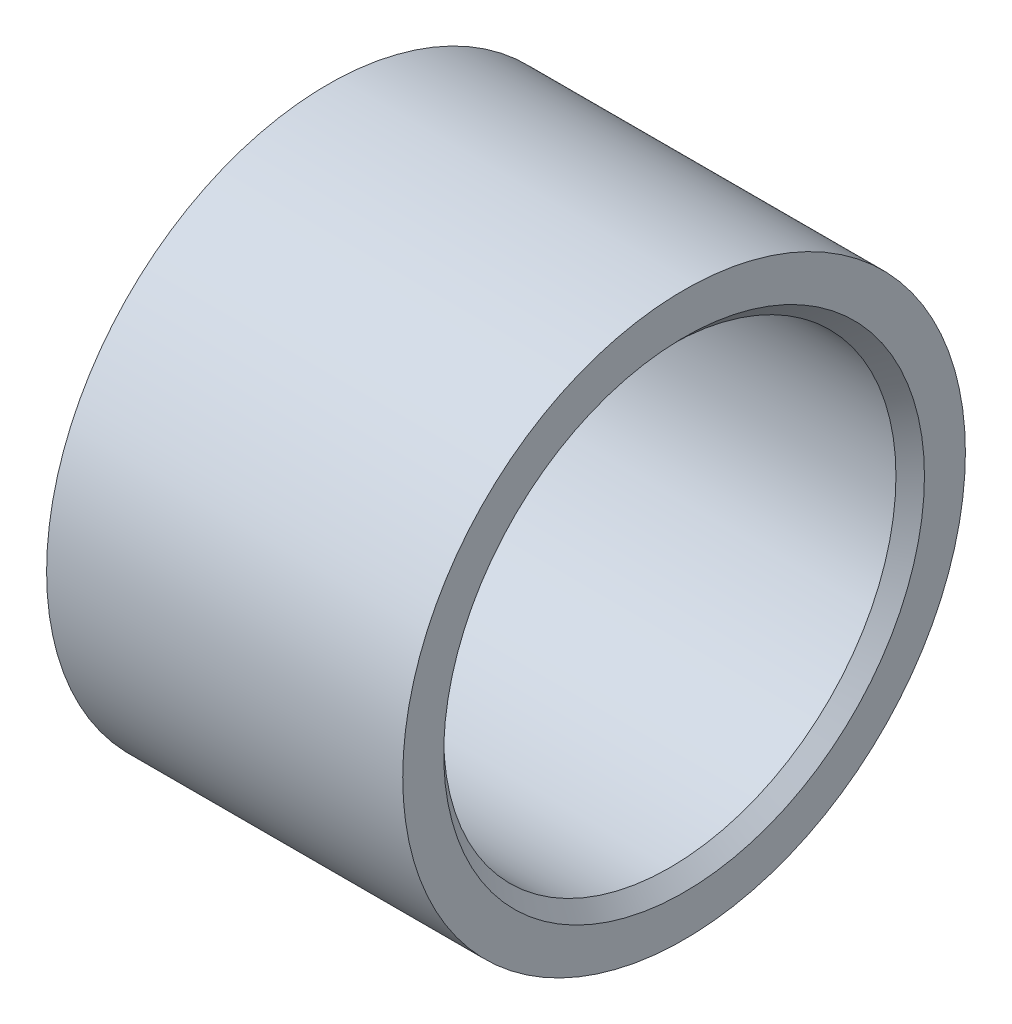
ISO-10303-21;
HEADER;
FILE_DESCRIPTION(('STEP AP214'),'2;1');
FILE_NAME('part.step','',(''),(''),'','','');
FILE_SCHEMA(('AUTOMOTIVE_DESIGN { 1 0 10303 214 1 1 1 1 }'));
ENDSEC;
DATA;
#1=APPLICATION_CONTEXT('core data for automotive mechanical design processes');
#2=APPLICATION_PROTOCOL_DEFINITION('international standard','automotive_design',2000,#1);
#3=PRODUCT_CONTEXT('',#1,'mechanical');
#4=PRODUCT('Part','Part','',(#3));
#5=PRODUCT_RELATED_PRODUCT_CATEGORY('part','',(#4));
#6=PRODUCT_DEFINITION_FORMATION('','',#4);
#7=PRODUCT_DEFINITION_CONTEXT('part definition',#1,'design');
#8=PRODUCT_DEFINITION('design','',#6,#7);
#9=PRODUCT_DEFINITION_SHAPE('','',#8);
#10=(LENGTH_UNIT() NAMED_UNIT(*) SI_UNIT(.MILLI.,.METRE.));
#11=(NAMED_UNIT(*) PLANE_ANGLE_UNIT() SI_UNIT($,.RADIAN.));
#12=(NAMED_UNIT(*) SI_UNIT($,.STERADIAN.) SOLID_ANGLE_UNIT());
#13=UNCERTAINTY_MEASURE_WITH_UNIT(LENGTH_MEASURE(1.E-05),#10,'distance_accuracy_value','');
#14=(GEOMETRIC_REPRESENTATION_CONTEXT(3) GLOBAL_UNCERTAINTY_ASSIGNED_CONTEXT((#13)) GLOBAL_UNIT_ASSIGNED_CONTEXT((#10,
#11,#12)) REPRESENTATION_CONTEXT('',''));
#15=CARTESIAN_POINT('',(0.,0.,0.));
#16=DIRECTION('',(0.,0.,1.));
#17=DIRECTION('',(1.,0.,0.));
#18=AXIS2_PLACEMENT_3D('',#15,#16,#17);
#19=CARTESIAN_POINT('',(64.916112484,313.555090565655,1400.10094117035));
#20=DIRECTION('',(1.,0.,0.));
#21=DIRECTION('',(0.,0.,-1.));
#22=AXIS2_PLACEMENT_3D('',#19,#20,#21);
#23=PLANE('',#22);
#24=CARTESIAN_POINT('',(64.916112484,313.555090565655,1400.10094117035));
#25=DIRECTION('',(1.,0.,0.));
#26=DIRECTION('',(0.,0.,-1.));
#27=AXIS2_PLACEMENT_3D('',#24,#25,#26);
#28=CIRCLE('',#27,8.57249999999987);
#29=CARTESIAN_POINT('',(64.916112484,313.555090565655,1391.52844117035));
#30=VERTEX_POINT('',#29);
#31=EDGE_CURVE('E10',#30,#30,#28,.F.);
#32=ORIENTED_EDGE('',*,*,#31,.T.);
#33=EDGE_LOOP('',(#32));
#34=FACE_BOUND('',#33,.T.);
#35=CARTESIAN_POINT('',(64.916112484,313.555090565655,1400.10094117035));
#36=DIRECTION('',(1.,0.,0.));
#37=DIRECTION('',(0.,0.,-1.));
#38=AXIS2_PLACEMENT_3D('',#35,#36,#37);
#39=CIRCLE('',#38,10.0329999999999);
#40=CARTESIAN_POINT('',(64.916112484,313.555090565655,1390.06794117035));
#41=VERTEX_POINT('',#40);
#42=EDGE_CURVE('E60',#41,#41,#39,.T.);
#43=ORIENTED_EDGE('',*,*,#42,.T.);
#44=EDGE_LOOP('',(#43));
#45=FACE_BOUND('',#44,.T.);
#46=ADVANCED_FACE('F39',(#34,#45),#23,.T.);
#47=CARTESIAN_POINT('',(52.216112484,313.555090565655,1400.10094117035));
#48=DIRECTION('',(1.,0.,0.));
#49=DIRECTION('',(0.,0.,-1.));
#50=AXIS2_PLACEMENT_3D('',#47,#48,#49);
#51=PLANE('',#50);
#52=CARTESIAN_POINT('',(52.216112484,313.555090565655,1400.10094117035));
#53=DIRECTION('',(1.,0.,0.));
#54=DIRECTION('',(0.,0.,-1.));
#55=AXIS2_PLACEMENT_3D('',#52,#53,#54);
#56=CIRCLE('',#55,8.57249999999987);
#57=CARTESIAN_POINT('',(52.216112484,313.555090565655,1391.52844117035));
#58=VERTEX_POINT('',#57);
#59=EDGE_CURVE('E55',#58,#58,#56,.T.);
#60=ORIENTED_EDGE('',*,*,#59,.T.);
#61=EDGE_LOOP('',(#60));
#62=FACE_BOUND('',#61,.T.);
#63=CARTESIAN_POINT('',(52.216112484,313.555090565655,1400.10094117035));
#64=DIRECTION('',(1.,0.,0.));
#65=DIRECTION('',(0.,0.,-1.));
#66=AXIS2_PLACEMENT_3D('',#63,#64,#65);
#67=CIRCLE('',#66,10.0329999999999);
#68=CARTESIAN_POINT('',(52.216112484,313.555090565655,1390.06794117035));
#69=VERTEX_POINT('',#68);
#70=EDGE_CURVE('E61',#69,#69,#67,.T.);
#71=ORIENTED_EDGE('',*,*,#70,.F.);
#72=EDGE_LOOP('',(#71));
#73=FACE_BOUND('',#72,.T.);
#74=ADVANCED_FACE('F72',(#62,#73),#51,.F.);
#75=CARTESIAN_POINT('',(64.916112484,313.555090565655,1400.10094117035));
#76=DIRECTION('',(-1.,0.,0.));
#77=DIRECTION('',(0.,0.,1.));
#78=AXIS2_PLACEMENT_3D('',#75,#76,#77);
#79=CYLINDRICAL_SURFACE('',#78,10.0329999999999);
#80=ORIENTED_EDGE('',*,*,#42,.F.);
#81=EDGE_LOOP('',(#80));
#82=FACE_BOUND('',#81,.T.);
#83=ORIENTED_EDGE('',*,*,#70,.T.);
#84=EDGE_LOOP('',(#83));
#85=FACE_BOUND('',#84,.T.);
#86=ADVANCED_FACE('F68',(#82,#85),#79,.T.);
#87=CARTESIAN_POINT('',(64.916112484,313.555090565655,1400.10094117035));
#88=DIRECTION('',(-1.,0.,0.));
#89=DIRECTION('',(0.,0.,1.));
#90=AXIS2_PLACEMENT_3D('',#87,#88,#89);
#91=CYLINDRICAL_SURFACE('',#90,8.06449999999994);
#92=CARTESIAN_POINT('',(52.7241124839999,313.555090565655,1400.10094117035));
#93=DIRECTION('',(1.,0.,0.));
#94=DIRECTION('',(0.,0.,-1.));
#95=AXIS2_PLACEMENT_3D('',#92,#93,#94);
#96=CIRCLE('',#95,8.06449999999994);
#97=CARTESIAN_POINT('',(52.7241124839999,313.555090565655,1392.03644117035));
#98=VERTEX_POINT('',#97);
#99=EDGE_CURVE('E47',#98,#98,#96,.F.);
#100=ORIENTED_EDGE('',*,*,#99,.T.);
#101=EDGE_LOOP('',(#100));
#102=FACE_BOUND('',#101,.T.);
#103=CARTESIAN_POINT('',(64.4081124839999,313.555090565655,1400.10094117035));
#104=DIRECTION('',(1.,0.,0.));
#105=DIRECTION('',(0.,0.,-1.));
#106=AXIS2_PLACEMENT_3D('',#103,#104,#105);
#107=CIRCLE('',#106,8.06449999999994);
#108=CARTESIAN_POINT('',(64.4081124839999,313.555090565655,1392.03644117035));
#109=VERTEX_POINT('',#108);
#110=EDGE_CURVE('E51',#109,#109,#107,.T.);
#111=ORIENTED_EDGE('',*,*,#110,.T.);
#112=EDGE_LOOP('',(#111));
#113=FACE_BOUND('',#112,.T.);
#114=ADVANCED_FACE('F71',(#102,#113),#91,.F.);
#115=CARTESIAN_POINT('',(52.216112484,313.555090565655,1400.10094117035));
#116=DIRECTION('',(-1.,0.,0.));
#117=DIRECTION('',(0.,0.,1.));
#118=AXIS2_PLACEMENT_3D('',#115,#116,#117);
#119=CONICAL_SURFACE('',#118,8.57249999999987,0.785398163397401);
#120=ORIENTED_EDGE('',*,*,#99,.F.);
#121=EDGE_LOOP('',(#120));
#122=FACE_BOUND('',#121,.T.);
#123=ORIENTED_EDGE('',*,*,#59,.F.);
#124=EDGE_LOOP('',(#123));
#125=FACE_BOUND('',#124,.T.);
#126=ADVANCED_FACE('F86',(#122,#125),#119,.F.);
#127=CARTESIAN_POINT('',(64.4081124839999,313.555090565655,1400.10094117035));
#128=DIRECTION('',(1.,0.,0.));
#129=DIRECTION('',(0.,0.,-1.));
#130=AXIS2_PLACEMENT_3D('',#127,#128,#129);
#131=CONICAL_SURFACE('',#130,8.06449999999994,0.785398163397373);
#132=ORIENTED_EDGE('',*,*,#31,.F.);
#133=EDGE_LOOP('',(#132));
#134=FACE_BOUND('',#133,.T.);
#135=ORIENTED_EDGE('',*,*,#110,.F.);
#136=EDGE_LOOP('',(#135));
#137=FACE_BOUND('',#136,.T.);
#138=ADVANCED_FACE('F42',(#134,#137),#131,.F.);
#139=CLOSED_SHELL('',(#46,#74,#86,#114,#126,#138));
#140=MANIFOLD_SOLID_BREP('B2',#139);
#141=ADVANCED_BREP_SHAPE_REPRESENTATION('',(#18,#140),#14);
#142=SHAPE_DEFINITION_REPRESENTATION(#9,#141);
ENDSEC;
END-ISO-10303-21;
